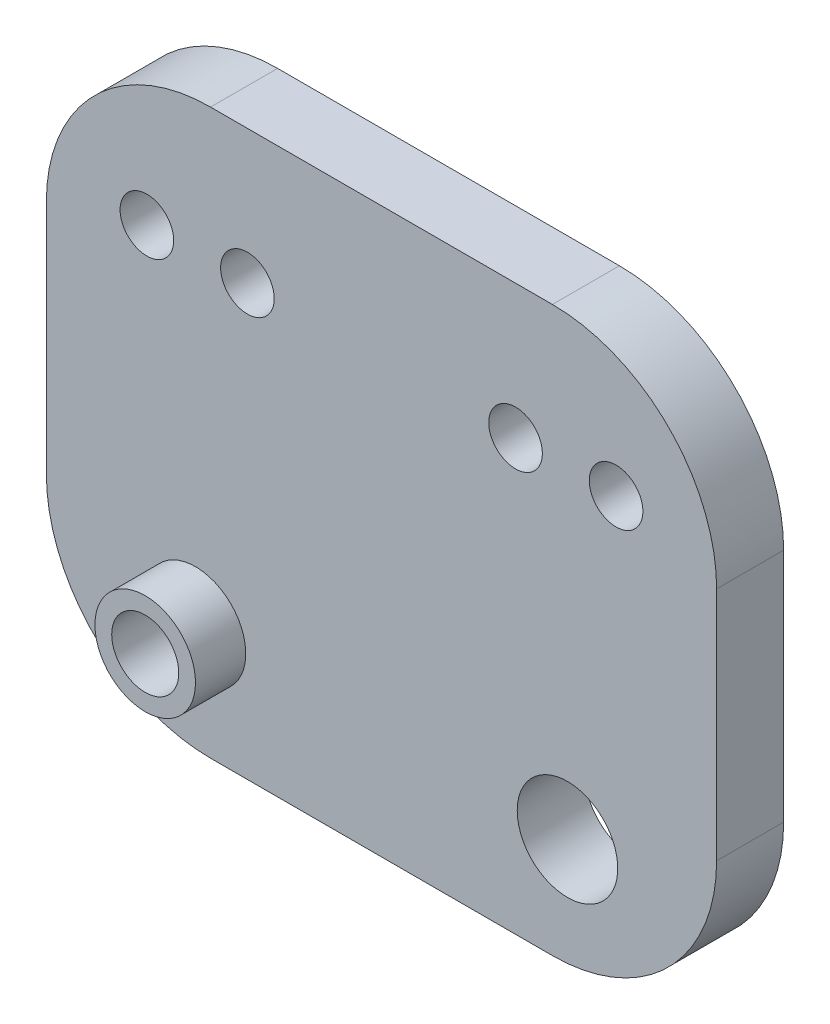
ISO-10303-21;
HEADER;
FILE_DESCRIPTION(('STEP AP214'),'2;1');
FILE_NAME('part.step','',(''),(''),'','','');
FILE_SCHEMA(('AUTOMOTIVE_DESIGN { 1 0 10303 214 1 1 1 1 }'));
ENDSEC;
DATA;
#1=APPLICATION_CONTEXT('core data for automotive mechanical design processes');
#2=APPLICATION_PROTOCOL_DEFINITION('international standard','automotive_design',2000,#1);
#3=PRODUCT_CONTEXT('',#1,'mechanical');
#4=PRODUCT('Part','Part','',(#3));
#5=PRODUCT_RELATED_PRODUCT_CATEGORY('part','',(#4));
#6=PRODUCT_DEFINITION_FORMATION('','',#4);
#7=PRODUCT_DEFINITION_CONTEXT('part definition',#1,'design');
#8=PRODUCT_DEFINITION('design','',#6,#7);
#9=PRODUCT_DEFINITION_SHAPE('','',#8);
#10=(LENGTH_UNIT() NAMED_UNIT(*) SI_UNIT(.MILLI.,.METRE.));
#11=(NAMED_UNIT(*) PLANE_ANGLE_UNIT() SI_UNIT($,.RADIAN.));
#12=(NAMED_UNIT(*) SI_UNIT($,.STERADIAN.) SOLID_ANGLE_UNIT());
#13=UNCERTAINTY_MEASURE_WITH_UNIT(LENGTH_MEASURE(1.E-05),#10,'distance_accuracy_value','');
#14=(GEOMETRIC_REPRESENTATION_CONTEXT(3) GLOBAL_UNCERTAINTY_ASSIGNED_CONTEXT((#13)) GLOBAL_UNIT_ASSIGNED_CONTEXT((#10,
#11,#12)) REPRESENTATION_CONTEXT('',''));
#15=CARTESIAN_POINT('',(0.,0.,0.));
#16=DIRECTION('',(0.,0.,1.));
#17=DIRECTION('',(1.,0.,0.));
#18=AXIS2_PLACEMENT_3D('',#15,#16,#17);
#19=CARTESIAN_POINT('',(35.,30.,28.));
#20=DIRECTION('',(0.,0.,1.));
#21=DIRECTION('',(1.,0.,0.));
#22=AXIS2_PLACEMENT_3D('',#19,#20,#21);
#23=CYLINDRICAL_SURFACE('',#22,4.00000000000001);
#24=CARTESIAN_POINT('',(35.,30.,38.));
#25=DIRECTION('',(0.,0.,1.));
#26=DIRECTION('',(1.,0.,0.));
#27=AXIS2_PLACEMENT_3D('',#24,#25,#26);
#28=CIRCLE('',#27,4.00000000000001);
#29=CARTESIAN_POINT('',(39.,30.,38.));
#30=VERTEX_POINT('',#29);
#31=EDGE_CURVE('E230',#30,#30,#28,.T.);
#32=ORIENTED_EDGE('',*,*,#31,.T.);
#33=EDGE_LOOP('',(#32));
#34=FACE_BOUND('',#33,.T.);
#35=CARTESIAN_POINT('',(35.,30.,32.));
#36=DIRECTION('',(0.,0.,-1.));
#37=DIRECTION('',(-1.,0.,0.));
#38=AXIS2_PLACEMENT_3D('',#35,#36,#37);
#39=CIRCLE('',#38,4.00000000000001);
#40=CARTESIAN_POINT('',(31.,30.,32.));
#41=VERTEX_POINT('',#40);
#42=EDGE_CURVE('E213',#41,#41,#39,.F.);
#43=ORIENTED_EDGE('',*,*,#42,.F.);
#44=EDGE_LOOP('',(#43));
#45=FACE_BOUND('',#44,.T.);
#46=ADVANCED_FACE('F39',(#34,#45),#23,.F.);
#47=CARTESIAN_POINT('',(-35.,30.,28.));
#48=DIRECTION('',(0.,0.,1.));
#49=DIRECTION('',(1.,0.,0.));
#50=AXIS2_PLACEMENT_3D('',#47,#48,#49);
#51=CYLINDRICAL_SURFACE('',#50,4.);
#52=CARTESIAN_POINT('',(-35.,30.,38.));
#53=DIRECTION('',(0.,0.,1.));
#54=DIRECTION('',(1.,0.,0.));
#55=AXIS2_PLACEMENT_3D('',#52,#53,#54);
#56=CIRCLE('',#55,4.);
#57=CARTESIAN_POINT('',(-31.,30.,38.));
#58=VERTEX_POINT('',#57);
#59=EDGE_CURVE('E226',#58,#58,#56,.T.);
#60=ORIENTED_EDGE('',*,*,#59,.T.);
#61=EDGE_LOOP('',(#60));
#62=FACE_BOUND('',#61,.T.);
#63=CARTESIAN_POINT('',(-35.,30.,32.));
#64=DIRECTION('',(0.,0.,-1.));
#65=DIRECTION('',(-1.,0.,0.));
#66=AXIS2_PLACEMENT_3D('',#63,#64,#65);
#67=CIRCLE('',#66,4.);
#68=CARTESIAN_POINT('',(-39.,30.,32.));
#69=VERTEX_POINT('',#68);
#70=EDGE_CURVE('E189',#69,#69,#67,.F.);
#71=ORIENTED_EDGE('',*,*,#70,.F.);
#72=EDGE_LOOP('',(#71));
#73=FACE_BOUND('',#72,.T.);
#74=ADVANCED_FACE('F369',(#62,#73),#51,.F.);
#75=CARTESIAN_POINT('',(-20.,30.,32.));
#76=DIRECTION('',(0.,0.,-1.));
#77=DIRECTION('',(-1.,0.,0.));
#78=AXIS2_PLACEMENT_3D('',#75,#76,#77);
#79=CYLINDRICAL_SURFACE('',#78,7.5);
#80=DIRECTION('',(0.,0.,-1.));
#81=VECTOR('',#80,1.);
#82=CARTESIAN_POINT('',(-20.,37.5,65.5410196624968));
#83=LINE('',#82,#81);
#84=CARTESIAN_POINT('',(-20.,37.5,32.));
#85=VERTEX_POINT('',#84);
#86=CARTESIAN_POINT('',(-20.,37.5,28.));
#87=VERTEX_POINT('',#86);
#88=EDGE_CURVE('E64',#85,#87,#83,.T.);
#89=ORIENTED_EDGE('',*,*,#88,.T.);
#90=CARTESIAN_POINT('',(-20.,30.,28.));
#91=DIRECTION('',(0.,0.,-1.));
#92=DIRECTION('',(-1.,0.,0.));
#93=AXIS2_PLACEMENT_3D('',#90,#91,#92);
#94=CIRCLE('',#93,7.5);
#95=CARTESIAN_POINT('',(-20.,22.5,28.));
#96=VERTEX_POINT('',#95);
#97=EDGE_CURVE('E216',#87,#96,#94,.T.);
#98=ORIENTED_EDGE('',*,*,#97,.T.);
#99=DIRECTION('',(0.,0.,-1.));
#100=VECTOR('',#99,1.);
#101=CARTESIAN_POINT('',(-20.,22.5,65.5410196624968));
#102=LINE('',#101,#100);
#103=CARTESIAN_POINT('',(-20.,22.5,32.));
#104=VERTEX_POINT('',#103);
#105=EDGE_CURVE('E203',#104,#96,#102,.T.);
#106=ORIENTED_EDGE('',*,*,#105,.F.);
#107=CARTESIAN_POINT('',(-20.,30.,32.));
#108=DIRECTION('',(0.,0.,-1.));
#109=DIRECTION('',(-1.,0.,0.));
#110=AXIS2_PLACEMENT_3D('',#107,#108,#109);
#111=CIRCLE('',#110,7.5);
#112=EDGE_CURVE('E221',#85,#104,#111,.T.);
#113=ORIENTED_EDGE('',*,*,#112,.F.);
#114=EDGE_LOOP('',(#89,#98,#106,#113));
#115=FACE_BOUND('',#114,.T.);
#116=ADVANCED_FACE('F375',(#115),#79,.F.);
#117=CARTESIAN_POINT('',(-20.,30.,28.));
#118=DIRECTION('',(0.,0.,1.));
#119=DIRECTION('',(1.,0.,0.));
#120=AXIS2_PLACEMENT_3D('',#117,#118,#119);
#121=CYLINDRICAL_SURFACE('',#120,4.);
#122=CARTESIAN_POINT('',(-20.,30.,38.));
#123=DIRECTION('',(0.,0.,1.));
#124=DIRECTION('',(1.,0.,0.));
#125=AXIS2_PLACEMENT_3D('',#122,#123,#124);
#126=CIRCLE('',#125,4.);
#127=CARTESIAN_POINT('',(-16.,30.,38.));
#128=VERTEX_POINT('',#127);
#129=EDGE_CURVE('E234',#128,#128,#126,.T.);
#130=ORIENTED_EDGE('',*,*,#129,.T.);
#131=EDGE_LOOP('',(#130));
#132=FACE_BOUND('',#131,.T.);
#133=CARTESIAN_POINT('',(-20.,30.,32.));
#134=DIRECTION('',(0.,0.,-1.));
#135=DIRECTION('',(-1.,0.,0.));
#136=AXIS2_PLACEMENT_3D('',#133,#134,#135);
#137=CIRCLE('',#136,4.);
#138=CARTESIAN_POINT('',(-24.,30.,32.));
#139=VERTEX_POINT('',#138);
#140=EDGE_CURVE('E259',#139,#139,#137,.F.);
#141=ORIENTED_EDGE('',*,*,#140,.F.);
#142=EDGE_LOOP('',(#141));
#143=FACE_BOUND('',#142,.T.);
#144=ADVANCED_FACE('F382',(#132,#143),#121,.F.);
#145=CARTESIAN_POINT('',(20.,30.,28.));
#146=DIRECTION('',(0.,0.,1.));
#147=DIRECTION('',(1.,0.,0.));
#148=AXIS2_PLACEMENT_3D('',#145,#146,#147);
#149=CYLINDRICAL_SURFACE('',#148,4.);
#150=CARTESIAN_POINT('',(20.,30.,38.));
#151=DIRECTION('',(0.,0.,1.));
#152=DIRECTION('',(1.,0.,0.));
#153=AXIS2_PLACEMENT_3D('',#150,#151,#152);
#154=CIRCLE('',#153,4.);
#155=CARTESIAN_POINT('',(24.,30.,38.));
#156=VERTEX_POINT('',#155);
#157=EDGE_CURVE('E231',#156,#156,#154,.T.);
#158=ORIENTED_EDGE('',*,*,#157,.T.);
#159=EDGE_LOOP('',(#158));
#160=FACE_BOUND('',#159,.T.);
#161=CARTESIAN_POINT('',(20.,30.,32.));
#162=DIRECTION('',(0.,0.,-1.));
#163=DIRECTION('',(-1.,0.,0.));
#164=AXIS2_PLACEMENT_3D('',#161,#162,#163);
#165=CIRCLE('',#164,4.);
#166=CARTESIAN_POINT('',(16.,30.,32.));
#167=VERTEX_POINT('',#166);
#168=EDGE_CURVE('E219',#167,#167,#165,.F.);
#169=ORIENTED_EDGE('',*,*,#168,.F.);
#170=EDGE_LOOP('',(#169));
#171=FACE_BOUND('',#170,.T.);
#172=ADVANCED_FACE('F381',(#160,#171),#149,.F.);
#173=CARTESIAN_POINT('',(-27.75,-18.,38.));
#174=DIRECTION('',(0.,0.,-1.));
#175=DIRECTION('',(-1.,0.,0.));
#176=AXIS2_PLACEMENT_3D('',#173,#174,#175);
#177=CYLINDRICAL_SURFACE('',#176,5.);
#178=CARTESIAN_POINT('',(-27.75,-18.,45.5));
#179=DIRECTION('',(0.,0.,1.));
#180=DIRECTION('',(1.,0.,0.));
#181=AXIS2_PLACEMENT_3D('',#178,#179,#180);
#182=CIRCLE('',#181,5.);
#183=CARTESIAN_POINT('',(-22.75,-18.,45.5));
#184=VERTEX_POINT('',#183);
#185=EDGE_CURVE('E262',#184,#184,#182,.T.);
#186=ORIENTED_EDGE('',*,*,#185,.T.);
#187=EDGE_LOOP('',(#186));
#188=FACE_BOUND('',#187,.T.);
#189=CARTESIAN_POINT('',(-27.75,-18.,38.));
#190=DIRECTION('',(0.,0.,-1.));
#191=DIRECTION('',(-1.,0.,0.));
#192=AXIS2_PLACEMENT_3D('',#189,#190,#191);
#193=CIRCLE('',#192,5.);
#194=CARTESIAN_POINT('',(-32.75,-18.,38.));
#195=VERTEX_POINT('',#194);
#196=EDGE_CURVE('E12',#195,#195,#193,.F.);
#197=ORIENTED_EDGE('',*,*,#196,.F.);
#198=EDGE_LOOP('',(#197));
#199=FACE_BOUND('',#198,.T.);
#200=ADVANCED_FACE('F394',(#188,#199),#177,.F.);
#201=CARTESIAN_POINT('',(0.,0.,38.));
#202=DIRECTION('',(0.,0.,-1.));
#203=DIRECTION('',(-1.,0.,0.));
#204=AXIS2_PLACEMENT_3D('',#201,#202,#203);
#205=PLANE('',#204);
#206=DIRECTION('',(1.,0.,0.));
#207=VECTOR('',#206,1.);
#208=CARTESIAN_POINT('',(50.,-34.1336013684248,38.));
#209=LINE('',#208,#207);
#210=CARTESIAN_POINT('',(-25.5,-34.1336013684248,38.));
#211=VERTEX_POINT('',#210);
#212=CARTESIAN_POINT('',(25.5,-34.1336013684248,38.));
#213=VERTEX_POINT('',#212);
#214=EDGE_CURVE('E244',#211,#213,#209,.T.);
#215=ORIENTED_EDGE('',*,*,#214,.T.);
#216=CARTESIAN_POINT('',(25.5,-9.63360136842477,38.));
#217=DIRECTION('',(0.,0.,-1.));
#218=DIRECTION('',(-1.,0.,0.));
#219=AXIS2_PLACEMENT_3D('',#216,#217,#218);
#220=CIRCLE('',#219,24.5);
#221=CARTESIAN_POINT('',(50.,-9.63360136842477,38.));
#222=VERTEX_POINT('',#221);
#223=EDGE_CURVE('E275',#213,#222,#220,.F.);
#224=ORIENTED_EDGE('',*,*,#223,.T.);
#225=DIRECTION('',(0.,1.,0.));
#226=VECTOR('',#225,1.);
#227=CARTESIAN_POINT('',(50.,40.,38.));
#228=LINE('',#227,#226);
#229=CARTESIAN_POINT('',(50.,25.5,38.));
#230=VERTEX_POINT('',#229);
#231=EDGE_CURVE('E254',#222,#230,#228,.T.);
#232=ORIENTED_EDGE('',*,*,#231,.T.);
#233=CARTESIAN_POINT('',(25.5,25.5,38.));
#234=DIRECTION('',(0.,0.,-1.));
#235=DIRECTION('',(-1.,0.,0.));
#236=AXIS2_PLACEMENT_3D('',#233,#234,#235);
#237=CIRCLE('',#236,24.5);
#238=CARTESIAN_POINT('',(25.5,50.,38.));
#239=VERTEX_POINT('',#238);
#240=EDGE_CURVE('E293',#230,#239,#237,.F.);
#241=ORIENTED_EDGE('',*,*,#240,.T.);
#242=DIRECTION('',(-1.,0.,0.));
#243=VECTOR('',#242,1.);
#244=CARTESIAN_POINT('',(50.,50.,38.));
#245=LINE('',#244,#243);
#246=CARTESIAN_POINT('',(-25.5,50.,38.));
#247=VERTEX_POINT('',#246);
#248=EDGE_CURVE('E253',#239,#247,#245,.T.);
#249=ORIENTED_EDGE('',*,*,#248,.T.);
#250=CARTESIAN_POINT('',(-25.5,25.5,38.));
#251=DIRECTION('',(0.,0.,-1.));
#252=DIRECTION('',(-1.,0.,0.));
#253=AXIS2_PLACEMENT_3D('',#250,#251,#252);
#254=CIRCLE('',#253,24.5);
#255=CARTESIAN_POINT('',(-50.,25.5,38.));
#256=VERTEX_POINT('',#255);
#257=EDGE_CURVE('E278',#247,#256,#254,.F.);
#258=ORIENTED_EDGE('',*,*,#257,.T.);
#259=DIRECTION('',(0.,-1.,0.));
#260=VECTOR('',#259,1.);
#261=CARTESIAN_POINT('',(-50.,40.,38.));
#262=LINE('',#261,#260);
#263=CARTESIAN_POINT('',(-50.,-9.63360136842479,38.));
#264=VERTEX_POINT('',#263);
#265=EDGE_CURVE('E250',#256,#264,#262,.T.);
#266=ORIENTED_EDGE('',*,*,#265,.T.);
#267=CARTESIAN_POINT('',(-25.5,-9.63360136842478,38.));
#268=DIRECTION('',(0.,0.,-1.));
#269=DIRECTION('',(-1.,0.,0.));
#270=AXIS2_PLACEMENT_3D('',#267,#268,#269);
#271=CIRCLE('',#270,24.5);
#272=EDGE_CURVE('E270',#264,#211,#271,.F.);
#273=ORIENTED_EDGE('',*,*,#272,.T.);
#274=EDGE_LOOP('',(#215,#224,#232,#241,#249,#258,#266,#273));
#275=FACE_BOUND('',#274,.T.);
#276=CARTESIAN_POINT('',(27.75,-18.,38.));
#277=DIRECTION('',(0.,0.,-1.));
#278=DIRECTION('',(-1.,0.,0.));
#279=AXIS2_PLACEMENT_3D('',#276,#277,#278);
#280=CIRCLE('',#279,7.5);
#281=CARTESIAN_POINT('',(20.25,-18.,38.));
#282=VERTEX_POINT('',#281);
#283=EDGE_CURVE('E248',#282,#282,#280,.T.);
#284=ORIENTED_EDGE('',*,*,#283,.T.);
#285=EDGE_LOOP('',(#284));
#286=FACE_BOUND('',#285,.T.);
#287=ORIENTED_EDGE('',*,*,#31,.F.);
#288=EDGE_LOOP('',(#287));
#289=FACE_BOUND('',#288,.T.);
#290=ORIENTED_EDGE('',*,*,#129,.F.);
#291=EDGE_LOOP('',(#290));
#292=FACE_BOUND('',#291,.T.);
#293=ORIENTED_EDGE('',*,*,#157,.F.);
#294=EDGE_LOOP('',(#293));
#295=FACE_BOUND('',#294,.T.);
#296=ORIENTED_EDGE('',*,*,#59,.F.);
#297=EDGE_LOOP('',(#296));
#298=FACE_BOUND('',#297,.T.);
#299=CARTESIAN_POINT('',(-27.75,-18.,38.));
#300=DIRECTION('',(0.,0.,-1.));
#301=DIRECTION('',(-1.,0.,0.));
#302=AXIS2_PLACEMENT_3D('',#299,#300,#301);
#303=CIRCLE('',#302,7.5);
#304=CARTESIAN_POINT('',(-35.25,-18.,38.));
#305=VERTEX_POINT('',#304);
#306=EDGE_CURVE('E48',#305,#305,#303,.F.);
#307=ORIENTED_EDGE('',*,*,#306,.F.);
#308=EDGE_LOOP('',(#307));
#309=FACE_BOUND('',#308,.T.);
#310=ADVANCED_FACE('F315',(#275,#286,#289,#292,#295,#298,#309),#205,.F.);
#311=CARTESIAN_POINT('',(-50.,50.,6.));
#312=DIRECTION('',(0.,-1.,0.));
#313=DIRECTION('',(0.,0.,-1.));
#314=AXIS2_PLACEMENT_3D('',#311,#312,#313);
#315=PLANE('',#314);
#316=DIRECTION('',(-1.,0.,0.));
#317=VECTOR('',#316,1.);
#318=CARTESIAN_POINT('',(-25.5,50.,28.));
#319=LINE('',#318,#317);
#320=CARTESIAN_POINT('',(25.5,50.,28.));
#321=VERTEX_POINT('',#320);
#322=CARTESIAN_POINT('',(-25.5,50.,28.));
#323=VERTEX_POINT('',#322);
#324=EDGE_CURVE('E229',#321,#323,#319,.T.);
#325=ORIENTED_EDGE('',*,*,#324,.T.);
#326=DIRECTION('',(0.,0.,-1.));
#327=VECTOR('',#326,1.);
#328=CARTESIAN_POINT('',(-25.5,50.,6.));
#329=LINE('',#328,#327);
#330=EDGE_CURVE('E267',#323,#247,#329,.F.);
#331=ORIENTED_EDGE('',*,*,#330,.T.);
#332=ORIENTED_EDGE('',*,*,#248,.F.);
#333=DIRECTION('',(0.,0.,-1.));
#334=VECTOR('',#333,1.);
#335=CARTESIAN_POINT('',(25.5,50.,6.));
#336=LINE('',#335,#334);
#337=EDGE_CURVE('E277',#239,#321,#336,.T.);
#338=ORIENTED_EDGE('',*,*,#337,.T.);
#339=EDGE_LOOP('',(#325,#331,#332,#338));
#340=FACE_BOUND('',#339,.T.);
#341=ADVANCED_FACE('F332',(#340),#315,.F.);
#342=CARTESIAN_POINT('',(-25.5,25.5,6.));
#343=DIRECTION('',(0.,0.,-1.));
#344=DIRECTION('',(-1.,0.,0.));
#345=AXIS2_PLACEMENT_3D('',#342,#343,#344);
#346=CYLINDRICAL_SURFACE('',#345,24.5);
#347=ORIENTED_EDGE('',*,*,#330,.F.);
#348=CARTESIAN_POINT('',(-25.5,25.5,28.));
#349=DIRECTION('',(0.,0.,-1.));
#350=DIRECTION('',(-1.,0.,0.));
#351=AXIS2_PLACEMENT_3D('',#348,#349,#350);
#352=CIRCLE('',#351,24.5);
#353=CARTESIAN_POINT('',(-50.,25.5,28.));
#354=VERTEX_POINT('',#353);
#355=EDGE_CURVE('E285',#354,#323,#352,.T.);
#356=ORIENTED_EDGE('',*,*,#355,.F.);
#357=DIRECTION('',(0.,0.,-1.));
#358=VECTOR('',#357,1.);
#359=CARTESIAN_POINT('',(-50.,25.5,6.));
#360=LINE('',#359,#358);
#361=EDGE_CURVE('E43',#256,#354,#360,.T.);
#362=ORIENTED_EDGE('',*,*,#361,.F.);
#363=ORIENTED_EDGE('',*,*,#257,.F.);
#364=EDGE_LOOP('',(#347,#356,#362,#363));
#365=FACE_BOUND('',#364,.T.);
#366=ADVANCED_FACE('F327',(#365),#346,.T.);
#367=CARTESIAN_POINT('',(25.5,25.5,6.));
#368=DIRECTION('',(0.,0.,-1.));
#369=DIRECTION('',(-1.,0.,0.));
#370=AXIS2_PLACEMENT_3D('',#367,#368,#369);
#371=CYLINDRICAL_SURFACE('',#370,24.5);
#372=CARTESIAN_POINT('',(25.5,25.5,28.));
#373=DIRECTION('',(0.,0.,-1.));
#374=DIRECTION('',(-1.,0.,0.));
#375=AXIS2_PLACEMENT_3D('',#372,#373,#374);
#376=CIRCLE('',#375,24.5);
#377=CARTESIAN_POINT('',(50.,25.5,28.));
#378=VERTEX_POINT('',#377);
#379=EDGE_CURVE('E290',#321,#378,#376,.T.);
#380=ORIENTED_EDGE('',*,*,#379,.F.);
#381=ORIENTED_EDGE('',*,*,#337,.F.);
#382=ORIENTED_EDGE('',*,*,#240,.F.);
#383=DIRECTION('',(0.,0.,-1.));
#384=VECTOR('',#383,1.);
#385=CARTESIAN_POINT('',(50.,25.5,6.));
#386=LINE('',#385,#384);
#387=EDGE_CURVE('E283',#378,#230,#386,.F.);
#388=ORIENTED_EDGE('',*,*,#387,.F.);
#389=EDGE_LOOP('',(#380,#381,#382,#388));
#390=FACE_BOUND('',#389,.T.);
#391=ADVANCED_FACE('F41',(#390),#371,.T.);
#392=CARTESIAN_POINT('',(-50.,-25.,6.));
#393=DIRECTION('',(1.,0.,0.));
#394=DIRECTION('',(0.,0.,-1.));
#395=AXIS2_PLACEMENT_3D('',#392,#393,#394);
#396=PLANE('',#395);
#397=ORIENTED_EDGE('',*,*,#265,.F.);
#398=ORIENTED_EDGE('',*,*,#361,.T.);
#399=DIRECTION('',(0.,-1.,0.));
#400=VECTOR('',#399,1.);
#401=CARTESIAN_POINT('',(-50.,40.,28.));
#402=LINE('',#401,#400);
#403=CARTESIAN_POINT('',(-50.,-9.63360136842479,28.));
#404=VERTEX_POINT('',#403);
#405=EDGE_CURVE('E240',#354,#404,#402,.T.);
#406=ORIENTED_EDGE('',*,*,#405,.T.);
#407=DIRECTION('',(0.,0.,-1.));
#408=VECTOR('',#407,1.);
#409=CARTESIAN_POINT('',(-50.,-9.63360136842479,6.));
#410=LINE('',#409,#408);
#411=EDGE_CURVE('E282',#404,#264,#410,.F.);
#412=ORIENTED_EDGE('',*,*,#411,.T.);
#413=EDGE_LOOP('',(#397,#398,#406,#412));
#414=FACE_BOUND('',#413,.T.);
#415=ADVANCED_FACE('F324',(#414),#396,.F.);
#416=CARTESIAN_POINT('',(50.,-34.1336013684248,38.));
#417=DIRECTION('',(0.,1.,0.));
#418=DIRECTION('',(-1.,0.,0.));
#419=AXIS2_PLACEMENT_3D('',#416,#417,#418);
#420=PLANE('',#419);
#421=DIRECTION('',(1.,0.,0.));
#422=VECTOR('',#421,1.);
#423=CARTESIAN_POINT('',(50.,-34.1336013684248,28.));
#424=LINE('',#423,#422);
#425=CARTESIAN_POINT('',(-25.5,-34.1336013684248,28.));
#426=VERTEX_POINT('',#425);
#427=CARTESIAN_POINT('',(25.5,-34.1336013684248,28.));
#428=VERTEX_POINT('',#427);
#429=EDGE_CURVE('E249',#426,#428,#424,.T.);
#430=ORIENTED_EDGE('',*,*,#429,.T.);
#431=DIRECTION('',(0.,0.,-1.));
#432=VECTOR('',#431,1.);
#433=CARTESIAN_POINT('',(25.5,-34.1336013684248,38.));
#434=LINE('',#433,#432);
#435=EDGE_CURVE('E268',#428,#213,#434,.F.);
#436=ORIENTED_EDGE('',*,*,#435,.T.);
#437=ORIENTED_EDGE('',*,*,#214,.F.);
#438=DIRECTION('',(0.,0.,-1.));
#439=VECTOR('',#438,1.);
#440=CARTESIAN_POINT('',(-25.5,-34.1336013684248,38.));
#441=LINE('',#440,#439);
#442=EDGE_CURVE('E271',#211,#426,#441,.T.);
#443=ORIENTED_EDGE('',*,*,#442,.T.);
#444=EDGE_LOOP('',(#430,#436,#437,#443));
#445=FACE_BOUND('',#444,.T.);
#446=ADVANCED_FACE('F348',(#445),#420,.F.);
#447=CARTESIAN_POINT('',(50.,-25.,6.));
#448=DIRECTION('',(-1.,0.,0.));
#449=DIRECTION('',(0.,0.,1.));
#450=AXIS2_PLACEMENT_3D('',#447,#448,#449);
#451=PLANE('',#450);
#452=ORIENTED_EDGE('',*,*,#231,.F.);
#453=DIRECTION('',(0.,0.,-1.));
#454=VECTOR('',#453,1.);
#455=CARTESIAN_POINT('',(50.,-9.63360136842477,6.));
#456=LINE('',#455,#454);
#457=CARTESIAN_POINT('',(50.,-9.63360136842477,28.));
#458=VERTEX_POINT('',#457);
#459=EDGE_CURVE('E279',#222,#458,#456,.T.);
#460=ORIENTED_EDGE('',*,*,#459,.T.);
#461=DIRECTION('',(0.,1.,0.));
#462=VECTOR('',#461,1.);
#463=CARTESIAN_POINT('',(50.,40.,28.));
#464=LINE('',#463,#462);
#465=EDGE_CURVE('E245',#458,#378,#464,.T.);
#466=ORIENTED_EDGE('',*,*,#465,.T.);
#467=ORIENTED_EDGE('',*,*,#387,.T.);
#468=EDGE_LOOP('',(#452,#460,#466,#467));
#469=FACE_BOUND('',#468,.T.);
#470=ADVANCED_FACE('F340',(#469),#451,.F.);
#471=CARTESIAN_POINT('',(0.,0.,28.));
#472=DIRECTION('',(0.,0.,-1.));
#473=DIRECTION('',(-1.,0.,0.));
#474=AXIS2_PLACEMENT_3D('',#471,#472,#473);
#475=PLANE('',#474);
#476=DIRECTION('',(1.,0.,0.));
#477=VECTOR('',#476,1.);
#478=CARTESIAN_POINT('',(35.,37.5,28.));
#479=LINE('',#478,#477);
#480=CARTESIAN_POINT('',(20.,37.5,28.));
#481=VERTEX_POINT('',#480);
#482=CARTESIAN_POINT('',(35.,37.5,28.));
#483=VERTEX_POINT('',#482);
#484=EDGE_CURVE('E162',#481,#483,#479,.T.);
#485=ORIENTED_EDGE('',*,*,#484,.F.);
#486=CARTESIAN_POINT('',(20.,30.,28.));
#487=DIRECTION('',(0.,0.,-1.));
#488=DIRECTION('',(-1.,0.,0.));
#489=AXIS2_PLACEMENT_3D('',#486,#487,#488);
#490=CIRCLE('',#489,7.5);
#491=CARTESIAN_POINT('',(20.,22.5,28.));
#492=VERTEX_POINT('',#491);
#493=EDGE_CURVE('E178',#492,#481,#490,.T.);
#494=ORIENTED_EDGE('',*,*,#493,.F.);
#495=DIRECTION('',(-1.,0.,0.));
#496=VECTOR('',#495,1.);
#497=CARTESIAN_POINT('',(35.,22.5,28.));
#498=LINE('',#497,#496);
#499=CARTESIAN_POINT('',(35.,22.5,28.));
#500=VERTEX_POINT('',#499);
#501=EDGE_CURVE('E158',#500,#492,#498,.T.);
#502=ORIENTED_EDGE('',*,*,#501,.F.);
#503=CARTESIAN_POINT('',(35.,30.,28.));
#504=DIRECTION('',(0.,0.,-1.));
#505=DIRECTION('',(-1.,0.,0.));
#506=AXIS2_PLACEMENT_3D('',#503,#504,#505);
#507=CIRCLE('',#506,7.5);
#508=EDGE_CURVE('E165',#483,#500,#507,.T.);
#509=ORIENTED_EDGE('',*,*,#508,.F.);
#510=EDGE_LOOP('',(#485,#494,#502,#509));
#511=FACE_BOUND('',#510,.T.);
#512=DIRECTION('',(1.,0.,0.));
#513=VECTOR('',#512,1.);
#514=CARTESIAN_POINT('',(-20.,37.5,28.));
#515=LINE('',#514,#513);
#516=CARTESIAN_POINT('',(-35.,37.5,28.));
#517=VERTEX_POINT('',#516);
#518=EDGE_CURVE('E201',#517,#87,#515,.T.);
#519=ORIENTED_EDGE('',*,*,#518,.F.);
#520=CARTESIAN_POINT('',(-35.,30.,28.));
#521=DIRECTION('',(0.,0.,-1.));
#522=DIRECTION('',(-1.,0.,0.));
#523=AXIS2_PLACEMENT_3D('',#520,#521,#522);
#524=CIRCLE('',#523,7.5);
#525=CARTESIAN_POINT('',(-35.,22.5,28.));
#526=VERTEX_POINT('',#525);
#527=EDGE_CURVE('E198',#526,#517,#524,.T.);
#528=ORIENTED_EDGE('',*,*,#527,.F.);
#529=DIRECTION('',(-1.,0.,0.));
#530=VECTOR('',#529,1.);
#531=CARTESIAN_POINT('',(-20.,22.5,28.));
#532=LINE('',#531,#530);
#533=EDGE_CURVE('E195',#96,#526,#532,.T.);
#534=ORIENTED_EDGE('',*,*,#533,.F.);
#535=ORIENTED_EDGE('',*,*,#97,.F.);
#536=EDGE_LOOP('',(#519,#528,#534,#535));
#537=FACE_BOUND('',#536,.T.);
#538=ORIENTED_EDGE('',*,*,#324,.F.);
#539=ORIENTED_EDGE('',*,*,#379,.T.);
#540=ORIENTED_EDGE('',*,*,#465,.F.);
#541=CARTESIAN_POINT('',(25.5,-9.63360136842477,28.));
#542=DIRECTION('',(0.,0.,-1.));
#543=DIRECTION('',(-1.,0.,0.));
#544=AXIS2_PLACEMENT_3D('',#541,#542,#543);
#545=CIRCLE('',#544,24.5);
#546=EDGE_CURVE('E274',#458,#428,#545,.T.);
#547=ORIENTED_EDGE('',*,*,#546,.T.);
#548=ORIENTED_EDGE('',*,*,#429,.F.);
#549=CARTESIAN_POINT('',(-25.5,-9.63360136842478,28.));
#550=DIRECTION('',(0.,0.,-1.));
#551=DIRECTION('',(-1.,0.,0.));
#552=AXIS2_PLACEMENT_3D('',#549,#550,#551);
#553=CIRCLE('',#552,24.5);
#554=EDGE_CURVE('E288',#426,#404,#553,.T.);
#555=ORIENTED_EDGE('',*,*,#554,.T.);
#556=ORIENTED_EDGE('',*,*,#405,.F.);
#557=ORIENTED_EDGE('',*,*,#355,.T.);
#558=EDGE_LOOP('',(#538,#539,#540,#547,#548,#555,#556,#557));
#559=FACE_BOUND('',#558,.T.);
#560=CARTESIAN_POINT('',(27.75,-18.,28.));
#561=DIRECTION('',(0.,0.,-1.));
#562=DIRECTION('',(-1.,0.,0.));
#563=AXIS2_PLACEMENT_3D('',#560,#561,#562);
#564=CIRCLE('',#563,7.5);
#565=CARTESIAN_POINT('',(20.25,-18.,28.));
#566=VERTEX_POINT('',#565);
#567=EDGE_CURVE('E243',#566,#566,#564,.T.);
#568=ORIENTED_EDGE('',*,*,#567,.F.);
#569=EDGE_LOOP('',(#568));
#570=FACE_BOUND('',#569,.T.);
#571=ADVANCED_FACE('F175',(#511,#537,#559,#570),#475,.T.);
#572=CARTESIAN_POINT('',(27.75,-18.,38.));
#573=DIRECTION('',(0.,0.,-1.));
#574=DIRECTION('',(-1.,0.,0.));
#575=AXIS2_PLACEMENT_3D('',#572,#573,#574);
#576=CYLINDRICAL_SURFACE('',#575,7.5);
#577=ORIENTED_EDGE('',*,*,#567,.T.);
#578=EDGE_LOOP('',(#577));
#579=FACE_BOUND('',#578,.T.);
#580=ORIENTED_EDGE('',*,*,#283,.F.);
#581=EDGE_LOOP('',(#580));
#582=FACE_BOUND('',#581,.T.);
#583=ADVANCED_FACE('F364',(#579,#582),#576,.F.);
#584=CARTESIAN_POINT('',(25.5,-9.63360136842477,6.));
#585=DIRECTION('',(0.,0.,-1.));
#586=DIRECTION('',(-1.,0.,0.));
#587=AXIS2_PLACEMENT_3D('',#584,#585,#586);
#588=CYLINDRICAL_SURFACE('',#587,24.5);
#589=ORIENTED_EDGE('',*,*,#223,.F.);
#590=ORIENTED_EDGE('',*,*,#435,.F.);
#591=ORIENTED_EDGE('',*,*,#546,.F.);
#592=ORIENTED_EDGE('',*,*,#459,.F.);
#593=EDGE_LOOP('',(#589,#590,#591,#592));
#594=FACE_BOUND('',#593,.T.);
#595=ADVANCED_FACE('F344',(#594),#588,.T.);
#596=CARTESIAN_POINT('',(-25.5,-9.63360136842478,38.));
#597=DIRECTION('',(0.,0.,-1.));
#598=DIRECTION('',(-1.,0.,0.));
#599=AXIS2_PLACEMENT_3D('',#596,#597,#598);
#600=CYLINDRICAL_SURFACE('',#599,24.5);
#601=ORIENTED_EDGE('',*,*,#272,.F.);
#602=ORIENTED_EDGE('',*,*,#411,.F.);
#603=ORIENTED_EDGE('',*,*,#554,.F.);
#604=ORIENTED_EDGE('',*,*,#442,.F.);
#605=EDGE_LOOP('',(#601,#602,#603,#604));
#606=FACE_BOUND('',#605,.T.);
#607=ADVANCED_FACE('F352',(#606),#600,.T.);
#608=CARTESIAN_POINT('',(-27.75,0.,45.5));
#609=DIRECTION('',(0.,0.,1.));
#610=DIRECTION('',(1.,0.,0.));
#611=AXIS2_PLACEMENT_3D('',#608,#609,#610);
#612=PLANE('',#611);
#613=CARTESIAN_POINT('',(-27.75,-18.,45.5));
#614=DIRECTION('',(0.,0.,1.));
#615=DIRECTION('',(1.,0.,0.));
#616=AXIS2_PLACEMENT_3D('',#613,#614,#615);
#617=CIRCLE('',#616,7.5);
#618=CARTESIAN_POINT('',(-20.25,-18.,45.5));
#619=VERTEX_POINT('',#618);
#620=EDGE_CURVE('E235',#619,#619,#617,.T.);
#621=ORIENTED_EDGE('',*,*,#620,.T.);
#622=EDGE_LOOP('',(#621));
#623=FACE_BOUND('',#622,.T.);
#624=ORIENTED_EDGE('',*,*,#185,.F.);
#625=EDGE_LOOP('',(#624));
#626=FACE_BOUND('',#625,.T.);
#627=ADVANCED_FACE('F354',(#623,#626),#612,.T.);
#628=CARTESIAN_POINT('',(-27.75,-18.,45.5));
#629=DIRECTION('',(0.,0.,-1.));
#630=DIRECTION('',(-1.,0.,0.));
#631=AXIS2_PLACEMENT_3D('',#628,#629,#630);
#632=CYLINDRICAL_SURFACE('',#631,7.5);
#633=ORIENTED_EDGE('',*,*,#620,.F.);
#634=EDGE_LOOP('',(#633));
#635=FACE_BOUND('',#634,.T.);
#636=ORIENTED_EDGE('',*,*,#306,.T.);
#637=EDGE_LOOP('',(#636));
#638=FACE_BOUND('',#637,.T.);
#639=ADVANCED_FACE('F361',(#635,#638),#632,.T.);
#640=CARTESIAN_POINT('',(0.,0.,38.));
#641=DIRECTION('',(0.,0.,-1.));
#642=DIRECTION('',(-1.,0.,0.));
#643=AXIS2_PLACEMENT_3D('',#640,#641,#642);
#644=PLANE('',#643);
#645=ORIENTED_EDGE('',*,*,#196,.T.);
#646=EDGE_LOOP('',(#645));
#647=FACE_BOUND('',#646,.T.);
#648=ADVANCED_FACE('F397',(#647),#644,.F.);
#649=CARTESIAN_POINT('',(20.,30.,32.));
#650=DIRECTION('',(0.,0.,-1.));
#651=DIRECTION('',(-1.,0.,0.));
#652=AXIS2_PLACEMENT_3D('',#649,#650,#651);
#653=PLANE('',#652);
#654=CARTESIAN_POINT('',(20.,30.,32.));
#655=DIRECTION('',(0.,0.,-1.));
#656=DIRECTION('',(-1.,0.,0.));
#657=AXIS2_PLACEMENT_3D('',#654,#655,#656);
#658=CIRCLE('',#657,7.5);
#659=CARTESIAN_POINT('',(20.,22.5,32.));
#660=VERTEX_POINT('',#659);
#661=CARTESIAN_POINT('',(20.,37.5,32.));
#662=VERTEX_POINT('',#661);
#663=EDGE_CURVE('E217',#660,#662,#658,.T.);
#664=ORIENTED_EDGE('',*,*,#663,.T.);
#665=DIRECTION('',(-1.,0.,0.));
#666=VECTOR('',#665,1.);
#667=CARTESIAN_POINT('',(35.,37.5,32.));
#668=LINE('',#667,#666);
#669=CARTESIAN_POINT('',(35.,37.5,32.));
#670=VERTEX_POINT('',#669);
#671=EDGE_CURVE('E184',#670,#662,#668,.T.);
#672=ORIENTED_EDGE('',*,*,#671,.F.);
#673=CARTESIAN_POINT('',(35.,30.,32.));
#674=DIRECTION('',(0.,0.,-1.));
#675=DIRECTION('',(-1.,0.,0.));
#676=AXIS2_PLACEMENT_3D('',#673,#674,#675);
#677=CIRCLE('',#676,7.5);
#678=CARTESIAN_POINT('',(35.,22.5,32.));
#679=VERTEX_POINT('',#678);
#680=EDGE_CURVE('E190',#679,#670,#677,.F.);
#681=ORIENTED_EDGE('',*,*,#680,.F.);
#682=DIRECTION('',(1.,0.,0.));
#683=VECTOR('',#682,1.);
#684=CARTESIAN_POINT('',(35.,22.5,32.));
#685=LINE('',#684,#683);
#686=EDGE_CURVE('E56',#660,#679,#685,.T.);
#687=ORIENTED_EDGE('',*,*,#686,.F.);
#688=EDGE_LOOP('',(#664,#672,#681,#687));
#689=FACE_BOUND('',#688,.T.);
#690=ORIENTED_EDGE('',*,*,#168,.T.);
#691=EDGE_LOOP('',(#690));
#692=FACE_BOUND('',#691,.T.);
#693=ORIENTED_EDGE('',*,*,#42,.T.);
#694=EDGE_LOOP('',(#693));
#695=FACE_BOUND('',#694,.T.);
#696=ADVANCED_FACE('F492',(#689,#692,#695),#653,.T.);
#697=CARTESIAN_POINT('',(20.,30.,32.));
#698=DIRECTION('',(0.,0.,-1.));
#699=DIRECTION('',(-1.,0.,0.));
#700=AXIS2_PLACEMENT_3D('',#697,#698,#699);
#701=CYLINDRICAL_SURFACE('',#700,7.5);
#702=ORIENTED_EDGE('',*,*,#493,.T.);
#703=DIRECTION('',(0.,0.,-1.));
#704=VECTOR('',#703,1.);
#705=CARTESIAN_POINT('',(20.,37.5,65.5410196624968));
#706=LINE('',#705,#704);
#707=EDGE_CURVE('E185',#662,#481,#706,.T.);
#708=ORIENTED_EDGE('',*,*,#707,.F.);
#709=ORIENTED_EDGE('',*,*,#663,.F.);
#710=DIRECTION('',(0.,0.,-1.));
#711=VECTOR('',#710,1.);
#712=CARTESIAN_POINT('',(20.,22.5,65.5410196624968));
#713=LINE('',#712,#711);
#714=EDGE_CURVE('E161',#660,#492,#713,.T.);
#715=ORIENTED_EDGE('',*,*,#714,.T.);
#716=EDGE_LOOP('',(#702,#708,#709,#715));
#717=FACE_BOUND('',#716,.T.);
#718=ADVANCED_FACE('F532',(#717),#701,.F.);
#719=CARTESIAN_POINT('',(-20.,30.,32.));
#720=DIRECTION('',(0.,0.,-1.));
#721=DIRECTION('',(-1.,0.,0.));
#722=AXIS2_PLACEMENT_3D('',#719,#720,#721);
#723=PLANE('',#722);
#724=ORIENTED_EDGE('',*,*,#112,.T.);
#725=DIRECTION('',(1.,0.,0.));
#726=VECTOR('',#725,1.);
#727=CARTESIAN_POINT('',(-20.,22.5,32.));
#728=LINE('',#727,#726);
#729=CARTESIAN_POINT('',(-35.,22.5,32.));
#730=VERTEX_POINT('',#729);
#731=EDGE_CURVE('E172',#730,#104,#728,.T.);
#732=ORIENTED_EDGE('',*,*,#731,.F.);
#733=CARTESIAN_POINT('',(-35.,30.,32.));
#734=DIRECTION('',(0.,0.,-1.));
#735=DIRECTION('',(-1.,0.,0.));
#736=AXIS2_PLACEMENT_3D('',#733,#734,#735);
#737=CIRCLE('',#736,7.5);
#738=CARTESIAN_POINT('',(-35.,37.5,32.));
#739=VERTEX_POINT('',#738);
#740=EDGE_CURVE('E191',#739,#730,#737,.F.);
#741=ORIENTED_EDGE('',*,*,#740,.F.);
#742=DIRECTION('',(-1.,0.,0.));
#743=VECTOR('',#742,1.);
#744=CARTESIAN_POINT('',(-20.,37.5,32.));
#745=LINE('',#744,#743);
#746=EDGE_CURVE('E193',#85,#739,#745,.T.);
#747=ORIENTED_EDGE('',*,*,#746,.F.);
#748=EDGE_LOOP('',(#724,#732,#741,#747));
#749=FACE_BOUND('',#748,.T.);
#750=ORIENTED_EDGE('',*,*,#140,.T.);
#751=EDGE_LOOP('',(#750));
#752=FACE_BOUND('',#751,.T.);
#753=ORIENTED_EDGE('',*,*,#70,.T.);
#754=EDGE_LOOP('',(#753));
#755=FACE_BOUND('',#754,.T.);
#756=ADVANCED_FACE('F543',(#749,#752,#755),#723,.T.);
#757=CARTESIAN_POINT('',(-20.,37.5,65.5410196624968));
#758=DIRECTION('',(0.,1.,0.));
#759=DIRECTION('',(0.,0.,1.));
#760=AXIS2_PLACEMENT_3D('',#757,#758,#759);
#761=PLANE('',#760);
#762=ORIENTED_EDGE('',*,*,#746,.T.);
#763=DIRECTION('',(0.,0.,-1.));
#764=VECTOR('',#763,1.);
#765=CARTESIAN_POINT('',(-35.,37.5,65.5410196624968));
#766=LINE('',#765,#764);
#767=EDGE_CURVE('E205',#739,#517,#766,.T.);
#768=ORIENTED_EDGE('',*,*,#767,.T.);
#769=ORIENTED_EDGE('',*,*,#518,.T.);
#770=ORIENTED_EDGE('',*,*,#88,.F.);
#771=EDGE_LOOP('',(#762,#768,#769,#770));
#772=FACE_BOUND('',#771,.T.);
#773=ADVANCED_FACE('F552',(#772),#761,.F.);
#774=CARTESIAN_POINT('',(-35.,30.,65.5410196624968));
#775=DIRECTION('',(0.,0.,-1.));
#776=DIRECTION('',(-1.,0.,0.));
#777=AXIS2_PLACEMENT_3D('',#774,#775,#776);
#778=CYLINDRICAL_SURFACE('',#777,7.5);
#779=ORIENTED_EDGE('',*,*,#740,.T.);
#780=DIRECTION('',(0.,0.,-1.));
#781=VECTOR('',#780,1.);
#782=CARTESIAN_POINT('',(-35.,22.5,65.5410196624968));
#783=LINE('',#782,#781);
#784=EDGE_CURVE('E207',#730,#526,#783,.T.);
#785=ORIENTED_EDGE('',*,*,#784,.T.);
#786=ORIENTED_EDGE('',*,*,#527,.T.);
#787=ORIENTED_EDGE('',*,*,#767,.F.);
#788=EDGE_LOOP('',(#779,#785,#786,#787));
#789=FACE_BOUND('',#788,.T.);
#790=ADVANCED_FACE('F562',(#789),#778,.F.);
#791=CARTESIAN_POINT('',(-20.,22.5,65.5410196624968));
#792=DIRECTION('',(0.,-1.,0.));
#793=DIRECTION('',(0.,0.,-1.));
#794=AXIS2_PLACEMENT_3D('',#791,#792,#793);
#795=PLANE('',#794);
#796=ORIENTED_EDGE('',*,*,#731,.T.);
#797=ORIENTED_EDGE('',*,*,#105,.T.);
#798=ORIENTED_EDGE('',*,*,#533,.T.);
#799=ORIENTED_EDGE('',*,*,#784,.F.);
#800=EDGE_LOOP('',(#796,#797,#798,#799));
#801=FACE_BOUND('',#800,.T.);
#802=ADVANCED_FACE('F571',(#801),#795,.F.);
#803=CARTESIAN_POINT('',(35.,30.,65.5410196624968));
#804=DIRECTION('',(0.,0.,-1.));
#805=DIRECTION('',(-1.,0.,0.));
#806=AXIS2_PLACEMENT_3D('',#803,#804,#805);
#807=CYLINDRICAL_SURFACE('',#806,7.5);
#808=ORIENTED_EDGE('',*,*,#680,.T.);
#809=DIRECTION('',(0.,0.,-1.));
#810=VECTOR('',#809,1.);
#811=CARTESIAN_POINT('',(35.,37.5,65.5410196624968));
#812=LINE('',#811,#810);
#813=EDGE_CURVE('E168',#670,#483,#812,.T.);
#814=ORIENTED_EDGE('',*,*,#813,.T.);
#815=ORIENTED_EDGE('',*,*,#508,.T.);
#816=DIRECTION('',(0.,0.,-1.));
#817=VECTOR('',#816,1.);
#818=CARTESIAN_POINT('',(35.,22.5,65.5410196624968));
#819=LINE('',#818,#817);
#820=EDGE_CURVE('E154',#679,#500,#819,.T.);
#821=ORIENTED_EDGE('',*,*,#820,.F.);
#822=EDGE_LOOP('',(#808,#814,#815,#821));
#823=FACE_BOUND('',#822,.T.);
#824=ADVANCED_FACE('F166',(#823),#807,.F.);
#825=CARTESIAN_POINT('',(35.,37.5,65.5410196624968));
#826=DIRECTION('',(0.,1.,0.));
#827=DIRECTION('',(0.,0.,1.));
#828=AXIS2_PLACEMENT_3D('',#825,#826,#827);
#829=PLANE('',#828);
#830=ORIENTED_EDGE('',*,*,#671,.T.);
#831=ORIENTED_EDGE('',*,*,#707,.T.);
#832=ORIENTED_EDGE('',*,*,#484,.T.);
#833=ORIENTED_EDGE('',*,*,#813,.F.);
#834=EDGE_LOOP('',(#830,#831,#832,#833));
#835=FACE_BOUND('',#834,.T.);
#836=ADVANCED_FACE('F590',(#835),#829,.F.);
#837=CARTESIAN_POINT('',(35.,22.5,65.5410196624968));
#838=DIRECTION('',(0.,-1.,0.));
#839=DIRECTION('',(0.,0.,-1.));
#840=AXIS2_PLACEMENT_3D('',#837,#838,#839);
#841=PLANE('',#840);
#842=ORIENTED_EDGE('',*,*,#686,.T.);
#843=ORIENTED_EDGE('',*,*,#820,.T.);
#844=ORIENTED_EDGE('',*,*,#501,.T.);
#845=ORIENTED_EDGE('',*,*,#714,.F.);
#846=EDGE_LOOP('',(#842,#843,#844,#845));
#847=FACE_BOUND('',#846,.T.);
#848=ADVANCED_FACE('F156',(#847),#841,.F.);
#849=CLOSED_SHELL('',(#46,#74,#116,#144,#172,#200,#310,#341,#366,#391,#415,#446,#470,#571,#583,
#595,#607,#627,#639,#648,#696,#718,#756,#773,#790,#802,#824,#836,#848));
#850=MANIFOLD_SOLID_BREP('B2',#849);
#851=ADVANCED_BREP_SHAPE_REPRESENTATION('',(#18,#850),#14);
#852=SHAPE_DEFINITION_REPRESENTATION(#9,#851);
ENDSEC;
END-ISO-10303-21;
